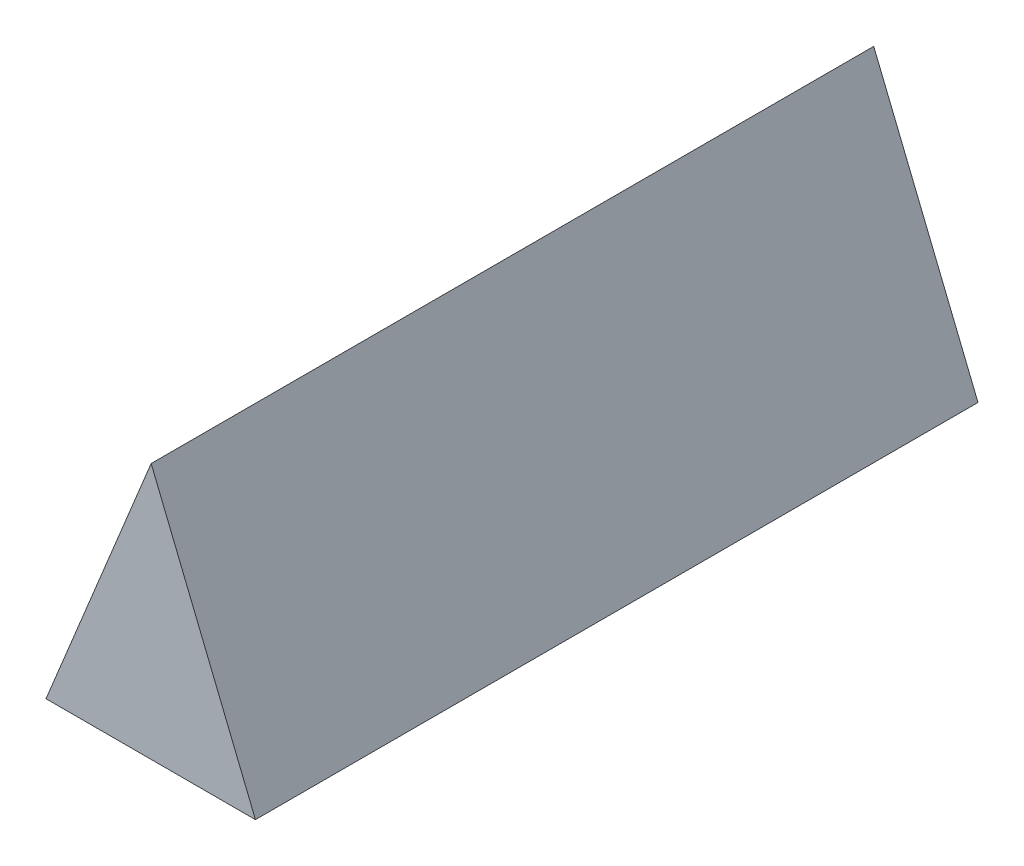
ISO-10303-21;
HEADER;
FILE_DESCRIPTION(('STEP AP214'),'2;1');
FILE_NAME('part.step','',(''),(''),'','','');
FILE_SCHEMA(('AUTOMOTIVE_DESIGN { 1 0 10303 214 1 1 1 1 }'));
ENDSEC;
DATA;
#1=APPLICATION_CONTEXT('core data for automotive mechanical design processes');
#2=APPLICATION_PROTOCOL_DEFINITION('international standard','automotive_design',2000,#1);
#3=PRODUCT_CONTEXT('',#1,'mechanical');
#4=PRODUCT('Part','Part','',(#3));
#5=PRODUCT_RELATED_PRODUCT_CATEGORY('part','',(#4));
#6=PRODUCT_DEFINITION_FORMATION('','',#4);
#7=PRODUCT_DEFINITION_CONTEXT('part definition',#1,'design');
#8=PRODUCT_DEFINITION('design','',#6,#7);
#9=PRODUCT_DEFINITION_SHAPE('','',#8);
#10=(LENGTH_UNIT() NAMED_UNIT(*) SI_UNIT(.MILLI.,.METRE.));
#11=(NAMED_UNIT(*) PLANE_ANGLE_UNIT() SI_UNIT($,.RADIAN.));
#12=(NAMED_UNIT(*) SI_UNIT($,.STERADIAN.) SOLID_ANGLE_UNIT());
#13=UNCERTAINTY_MEASURE_WITH_UNIT(LENGTH_MEASURE(1.E-05),#10,'distance_accuracy_value','');
#14=(GEOMETRIC_REPRESENTATION_CONTEXT(3) GLOBAL_UNCERTAINTY_ASSIGNED_CONTEXT((#13)) GLOBAL_UNIT_ASSIGNED_CONTEXT((#10,
#11,#12)) REPRESENTATION_CONTEXT('',''));
#15=CARTESIAN_POINT('',(0.,0.,0.));
#16=DIRECTION('',(0.,0.,1.));
#17=DIRECTION('',(1.,0.,0.));
#18=AXIS2_PLACEMENT_3D('',#15,#16,#17);
#19=CARTESIAN_POINT('',(5.737681426906,1.309958538179,0.));
#20=DIRECTION('',(-0.925158566200218,0.379580857507801,0.));
#21=DIRECTION('',(-0.379580857507801,-0.925158566200218,0.));
#22=AXIS2_PLACEMENT_3D('',#19,#20,#21);
#23=PLANE('',#22);
#24=DIRECTION('',(-0.379580857507801,-0.925158566200218,0.));
#25=VECTOR('',#24,1.);
#26=CARTESIAN_POINT('',(5.737681426906,1.309958538179,0.));
#27=LINE('',#26,#25);
#28=CARTESIAN_POINT('',(5.737681426906,1.309958538179,0.));
#29=VERTEX_POINT('',#28);
#30=CARTESIAN_POINT('',(5.723129026906,1.274489738179,0.));
#31=VERTEX_POINT('',#30);
#32=EDGE_CURVE('E11',#29,#31,#27,.T.);
#33=ORIENTED_EDGE('',*,*,#32,.T.);
#34=DIRECTION('',(0.,0.,1.));
#35=VECTOR('',#34,1.);
#36=CARTESIAN_POINT('',(5.723129026906,1.274489738179,0.));
#37=LINE('',#36,#35);
#38=CARTESIAN_POINT('',(5.723129026906,1.274489738179,0.1));
#39=VERTEX_POINT('',#38);
#40=EDGE_CURVE('E24',#31,#39,#37,.T.);
#41=ORIENTED_EDGE('',*,*,#40,.T.);
#42=DIRECTION('',(-0.379580857507801,-0.925158566200218,0.));
#43=VECTOR('',#42,1.);
#44=CARTESIAN_POINT('',(5.737681426906,1.309958538179,0.1));
#45=LINE('',#44,#43);
#46=CARTESIAN_POINT('',(5.737681426906,1.309958538179,0.1));
#47=VERTEX_POINT('',#46);
#48=EDGE_CURVE('E67',#47,#39,#45,.T.);
#49=ORIENTED_EDGE('',*,*,#48,.F.);
#50=DIRECTION('',(0.,0.,1.));
#51=VECTOR('',#50,1.);
#52=CARTESIAN_POINT('',(5.737681426906,1.309958538179,0.));
#53=LINE('',#52,#51);
#54=EDGE_CURVE('E54',#29,#47,#53,.T.);
#55=ORIENTED_EDGE('',*,*,#54,.F.);
#56=EDGE_LOOP('',(#33,#41,#49,#55));
#57=FACE_BOUND('',#56,.T.);
#58=ADVANCED_FACE('F17',(#57),#23,.T.);
#59=CARTESIAN_POINT('',(5.752113946783,1.274489738179,0.));
#60=DIRECTION('',(0.926254074513312,0.376899707412315,0.));
#61=DIRECTION('',(-0.376899707412315,0.926254074513312,0.));
#62=AXIS2_PLACEMENT_3D('',#59,#60,#61);
#63=PLANE('',#62);
#64=DIRECTION('',(-0.376899707412315,0.926254074513312,0.));
#65=VECTOR('',#64,1.);
#66=CARTESIAN_POINT('',(5.752113946783,1.274489738179,0.));
#67=LINE('',#66,#65);
#68=CARTESIAN_POINT('',(5.752113946783,1.274489738179,0.));
#69=VERTEX_POINT('',#68);
#70=EDGE_CURVE('E58',#69,#29,#67,.T.);
#71=ORIENTED_EDGE('',*,*,#70,.T.);
#72=ORIENTED_EDGE('',*,*,#54,.T.);
#73=DIRECTION('',(-0.376899707412315,0.926254074513312,0.));
#74=VECTOR('',#73,1.);
#75=CARTESIAN_POINT('',(5.752113946783,1.274489738179,0.1));
#76=LINE('',#75,#74);
#77=CARTESIAN_POINT('',(5.752113946783,1.274489738179,0.1));
#78=VERTEX_POINT('',#77);
#79=EDGE_CURVE('E48',#78,#47,#76,.T.);
#80=ORIENTED_EDGE('',*,*,#79,.F.);
#81=DIRECTION('',(0.,0.,1.));
#82=VECTOR('',#81,1.);
#83=CARTESIAN_POINT('',(5.752113946783,1.274489738179,0.));
#84=LINE('',#83,#82);
#85=EDGE_CURVE('E52',#69,#78,#84,.T.);
#86=ORIENTED_EDGE('',*,*,#85,.F.);
#87=EDGE_LOOP('',(#71,#72,#80,#86));
#88=FACE_BOUND('',#87,.T.);
#89=ADVANCED_FACE('F51',(#88),#63,.T.);
#90=CARTESIAN_POINT('',(5.723129026906,1.274489738179,0.));
#91=DIRECTION('',(0.,-1.,0.));
#92=DIRECTION('',(1.,0.,0.));
#93=AXIS2_PLACEMENT_3D('',#90,#91,#92);
#94=PLANE('',#93);
#95=DIRECTION('',(1.,0.,0.));
#96=VECTOR('',#95,1.);
#97=CARTESIAN_POINT('',(5.723129026906,1.274489738179,0.));
#98=LINE('',#97,#96);
#99=EDGE_CURVE('E64',#31,#69,#98,.T.);
#100=ORIENTED_EDGE('',*,*,#99,.T.);
#101=ORIENTED_EDGE('',*,*,#85,.T.);
#102=DIRECTION('',(1.,0.,0.));
#103=VECTOR('',#102,1.);
#104=CARTESIAN_POINT('',(5.723129026906,1.274489738179,0.1));
#105=LINE('',#104,#103);
#106=EDGE_CURVE('E63',#39,#78,#105,.T.);
#107=ORIENTED_EDGE('',*,*,#106,.F.);
#108=ORIENTED_EDGE('',*,*,#40,.F.);
#109=EDGE_LOOP('',(#100,#101,#107,#108));
#110=FACE_BOUND('',#109,.T.);
#111=ADVANCED_FACE('F62',(#110),#94,.T.);
#112=CARTESIAN_POINT('',(5.737640120978,1.287357153258,0.1));
#113=DIRECTION('',(0.,0.,1.));
#114=DIRECTION('',(1.,0.,0.));
#115=AXIS2_PLACEMENT_3D('',#112,#113,#114);
#116=PLANE('',#115);
#117=ORIENTED_EDGE('',*,*,#106,.T.);
#118=ORIENTED_EDGE('',*,*,#79,.T.);
#119=ORIENTED_EDGE('',*,*,#48,.T.);
#120=EDGE_LOOP('',(#117,#118,#119));
#121=FACE_BOUND('',#120,.T.);
#122=ADVANCED_FACE('F66',(#121),#116,.T.);
#123=CARTESIAN_POINT('',(5.737640120978,1.287357153258,0.));
#124=DIRECTION('',(0.,0.,1.));
#125=DIRECTION('',(1.,0.,0.));
#126=AXIS2_PLACEMENT_3D('',#123,#124,#125);
#127=PLANE('',#126);
#128=ORIENTED_EDGE('',*,*,#99,.F.);
#129=ORIENTED_EDGE('',*,*,#32,.F.);
#130=ORIENTED_EDGE('',*,*,#70,.F.);
#131=EDGE_LOOP('',(#128,#129,#130));
#132=FACE_BOUND('',#131,.T.);
#133=ADVANCED_FACE('F73',(#132),#127,.F.);
#134=CLOSED_SHELL('',(#58,#89,#111,#122,#133));
#135=MANIFOLD_SOLID_BREP('B1',#134);
#136=ADVANCED_BREP_SHAPE_REPRESENTATION('',(#18,#135),#14);
#137=SHAPE_DEFINITION_REPRESENTATION(#9,#136);
ENDSEC;
END-ISO-10303-21;
